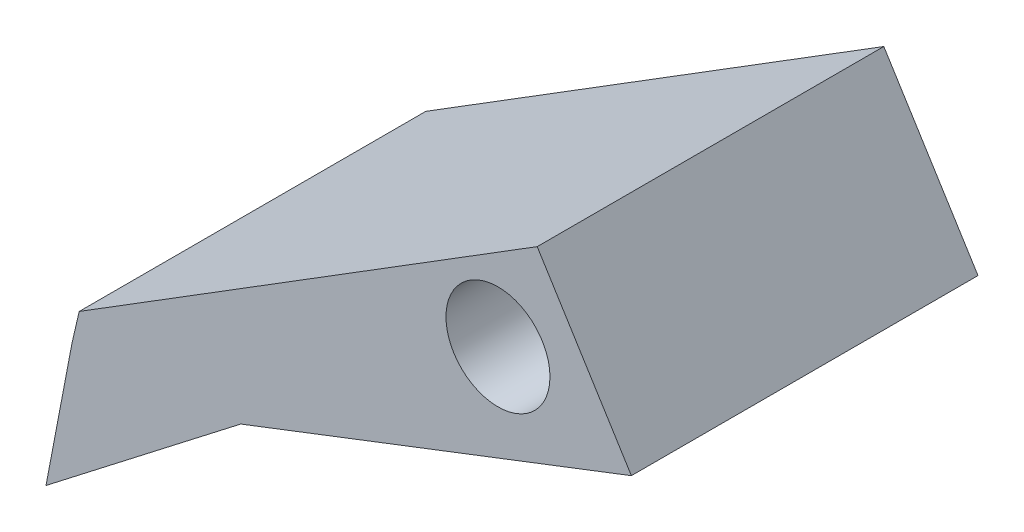
ISO-10303-21;
HEADER;
FILE_DESCRIPTION(('STEP AP214'),'2;1');
FILE_NAME('part.step','',(''),(''),'','','');
FILE_SCHEMA(('AUTOMOTIVE_DESIGN { 1 0 10303 214 1 1 1 1 }'));
ENDSEC;
DATA;
#1=APPLICATION_CONTEXT('core data for automotive mechanical design processes');
#2=APPLICATION_PROTOCOL_DEFINITION('international standard','automotive_design',2000,#1);
#3=PRODUCT_CONTEXT('',#1,'mechanical');
#4=PRODUCT('Part','Part','',(#3));
#5=PRODUCT_RELATED_PRODUCT_CATEGORY('part','',(#4));
#6=PRODUCT_DEFINITION_FORMATION('','',#4);
#7=PRODUCT_DEFINITION_CONTEXT('part definition',#1,'design');
#8=PRODUCT_DEFINITION('design','',#6,#7);
#9=PRODUCT_DEFINITION_SHAPE('','',#8);
#10=(LENGTH_UNIT() NAMED_UNIT(*) SI_UNIT(.MILLI.,.METRE.));
#11=(NAMED_UNIT(*) PLANE_ANGLE_UNIT() SI_UNIT($,.RADIAN.));
#12=(NAMED_UNIT(*) SI_UNIT($,.STERADIAN.) SOLID_ANGLE_UNIT());
#13=UNCERTAINTY_MEASURE_WITH_UNIT(LENGTH_MEASURE(1.E-05),#10,'distance_accuracy_value','');
#14=(GEOMETRIC_REPRESENTATION_CONTEXT(3) GLOBAL_UNCERTAINTY_ASSIGNED_CONTEXT((#13)) GLOBAL_UNIT_ASSIGNED_CONTEXT((#10,
#11,#12)) REPRESENTATION_CONTEXT('',''));
#15=CARTESIAN_POINT('',(0.,0.,0.));
#16=DIRECTION('',(0.,0.,1.));
#17=DIRECTION('',(1.,0.,0.));
#18=AXIS2_PLACEMENT_3D('',#15,#16,#17);
#19=CARTESIAN_POINT('',(0.,0.,10.));
#20=DIRECTION('',(0.,0.,-1.));
#21=DIRECTION('',(-1.,0.,0.));
#22=AXIS2_PLACEMENT_3D('',#19,#20,#21);
#23=PLANE('',#22);
#24=DIRECTION('',(0.79110087859855,0.611685703511698,0.));
#25=VECTOR('',#24,1.);
#26=CARTESIAN_POINT('',(0.,18.0912687522969,10.));
#27=LINE('',#26,#25);
#28=CARTESIAN_POINT('',(0.,18.0912687522969,10.));
#29=VERTEX_POINT('',#28);
#30=CARTESIAN_POINT('',(5.61872422569243,22.4357125189621,10.));
#31=VERTEX_POINT('',#30);
#32=EDGE_CURVE('E131',#29,#31,#27,.T.);
#33=ORIENTED_EDGE('',*,*,#32,.T.);
#34=DIRECTION('',(0.933066568106033,0.359703738488815,0.));
#35=VECTOR('',#34,1.);
#36=CARTESIAN_POINT('',(5.61872422569243,22.4357125189621,10.));
#37=LINE('',#36,#35);
#38=CARTESIAN_POINT('',(16.8881518183056,26.7801562856273,10.));
#39=VERTEX_POINT('',#38);
#40=EDGE_CURVE('E89',#31,#39,#37,.T.);
#41=ORIENTED_EDGE('',*,*,#40,.T.);
#42=DIRECTION('',(-0.528499803503971,0.848933423594727,0.));
#43=VECTOR('',#42,1.);
#44=CARTESIAN_POINT('',(14.1710727650188,31.1446219062223,10.));
#45=LINE('',#44,#43);
#46=CARTESIAN_POINT('',(14.1710727650188,31.1446219062223,10.));
#47=VERTEX_POINT('',#46);
#48=EDGE_CURVE('E102',#39,#47,#45,.T.);
#49=ORIENTED_EDGE('',*,*,#48,.T.);
#50=DIRECTION('',(-0.848933423594727,-0.528499803503972,0.));
#51=VECTOR('',#50,1.);
#52=CARTESIAN_POINT('',(0.958016554359848,22.9188913401539,10.));
#53=LINE('',#52,#51);
#54=CARTESIAN_POINT('',(0.958016554359848,22.9188913401539,10.));
#55=VERTEX_POINT('',#54);
#56=EDGE_CURVE('E96',#47,#55,#53,.T.);
#57=ORIENTED_EDGE('',*,*,#56,.T.);
#58=DIRECTION('',(-0.226580785686339,-0.973992375513156,0.));
#59=VECTOR('',#58,1.);
#60=CARTESIAN_POINT('',(0.752978387852972,22.037503228351,10.));
#61=LINE('',#60,#59);
#62=CARTESIAN_POINT('',(0.752978387852972,22.037503228351,10.));
#63=VERTEX_POINT('',#62);
#64=EDGE_CURVE('E100',#55,#63,#61,.T.);
#65=ORIENTED_EDGE('',*,*,#64,.T.);
#66=DIRECTION('',(-0.187427884692937,-0.982278365861496,0.));
#67=VECTOR('',#66,1.);
#68=CARTESIAN_POINT('',(0.,18.0912687522969,10.));
#69=LINE('',#68,#67);
#70=EDGE_CURVE('E52',#63,#29,#69,.T.);
#71=ORIENTED_EDGE('',*,*,#70,.T.);
#72=EDGE_LOOP('',(#33,#41,#49,#57,#65,#71));
#73=FACE_BOUND('',#72,.T.);
#74=CARTESIAN_POINT('',(13.0393468514576,28.0752855182967,10.));
#75=DIRECTION('',(0.,0.,1.));
#76=DIRECTION('',(1.,0.,0.));
#77=AXIS2_PLACEMENT_3D('',#74,#75,#76);
#78=CIRCLE('',#77,1.5);
#79=CARTESIAN_POINT('',(14.5393468514576,28.0752855182967,10.));
#80=VERTEX_POINT('',#79);
#81=EDGE_CURVE('E124',#80,#80,#78,.T.);
#82=ORIENTED_EDGE('',*,*,#81,.F.);
#83=EDGE_LOOP('',(#82));
#84=FACE_BOUND('',#83,.T.);
#85=ADVANCED_FACE('F35',(#73,#84),#23,.F.);
#86=CARTESIAN_POINT('',(0.,0.,0.));
#87=DIRECTION('',(0.,0.,-1.));
#88=DIRECTION('',(-1.,0.,0.));
#89=AXIS2_PLACEMENT_3D('',#86,#87,#88);
#90=PLANE('',#89);
#91=DIRECTION('',(0.79110087859855,0.611685703511698,0.));
#92=VECTOR('',#91,1.);
#93=CARTESIAN_POINT('',(0.,18.0912687522969,0.));
#94=LINE('',#93,#92);
#95=CARTESIAN_POINT('',(0.,18.0912687522969,0.));
#96=VERTEX_POINT('',#95);
#97=CARTESIAN_POINT('',(5.61872422569243,22.4357125189621,0.));
#98=VERTEX_POINT('',#97);
#99=EDGE_CURVE('E120',#96,#98,#94,.T.);
#100=ORIENTED_EDGE('',*,*,#99,.F.);
#101=DIRECTION('',(-0.187427884692937,-0.982278365861496,0.));
#102=VECTOR('',#101,1.);
#103=CARTESIAN_POINT('',(0.,18.0912687522969,0.));
#104=LINE('',#103,#102);
#105=CARTESIAN_POINT('',(0.752978387852972,22.037503228351,0.));
#106=VERTEX_POINT('',#105);
#107=EDGE_CURVE('E81',#106,#96,#104,.T.);
#108=ORIENTED_EDGE('',*,*,#107,.F.);
#109=DIRECTION('',(-0.226580785686339,-0.973992375513156,0.));
#110=VECTOR('',#109,1.);
#111=CARTESIAN_POINT('',(0.752978387852972,22.037503228351,0.));
#112=LINE('',#111,#110);
#113=CARTESIAN_POINT('',(0.958016554359848,22.9188913401539,0.));
#114=VERTEX_POINT('',#113);
#115=EDGE_CURVE('E75',#114,#106,#112,.T.);
#116=ORIENTED_EDGE('',*,*,#115,.F.);
#117=DIRECTION('',(-0.848933423594727,-0.528499803503972,0.));
#118=VECTOR('',#117,1.);
#119=CARTESIAN_POINT('',(0.958016554359848,22.9188913401539,0.));
#120=LINE('',#119,#118);
#121=CARTESIAN_POINT('',(14.1710727650188,31.1446219062223,0.));
#122=VERTEX_POINT('',#121);
#123=EDGE_CURVE('E110',#122,#114,#120,.T.);
#124=ORIENTED_EDGE('',*,*,#123,.F.);
#125=DIRECTION('',(-0.528499803503971,0.848933423594727,0.));
#126=VECTOR('',#125,1.);
#127=CARTESIAN_POINT('',(14.1710727650188,31.1446219062223,0.));
#128=LINE('',#127,#126);
#129=CARTESIAN_POINT('',(16.8881518183056,26.7801562856273,0.));
#130=VERTEX_POINT('',#129);
#131=EDGE_CURVE('E126',#130,#122,#128,.T.);
#132=ORIENTED_EDGE('',*,*,#131,.F.);
#133=DIRECTION('',(0.933066568106033,0.359703738488815,0.));
#134=VECTOR('',#133,1.);
#135=CARTESIAN_POINT('',(5.61872422569243,22.4357125189621,0.));
#136=LINE('',#135,#134);
#137=EDGE_CURVE('E123',#98,#130,#136,.T.);
#138=ORIENTED_EDGE('',*,*,#137,.F.);
#139=EDGE_LOOP('',(#100,#108,#116,#124,#132,#138));
#140=FACE_BOUND('',#139,.T.);
#141=CARTESIAN_POINT('',(13.0393468514576,28.0752855182967,0.));
#142=DIRECTION('',(0.,0.,1.));
#143=DIRECTION('',(1.,0.,0.));
#144=AXIS2_PLACEMENT_3D('',#141,#142,#143);
#145=CIRCLE('',#144,1.5);
#146=CARTESIAN_POINT('',(14.5393468514576,28.0752855182967,0.));
#147=VERTEX_POINT('',#146);
#148=EDGE_CURVE('E224',#147,#147,#145,.T.);
#149=ORIENTED_EDGE('',*,*,#148,.T.);
#150=EDGE_LOOP('',(#149));
#151=FACE_BOUND('',#150,.T.);
#152=ADVANCED_FACE('F140',(#140,#151),#90,.T.);
#153=CARTESIAN_POINT('',(0.,18.0912687522969,10.));
#154=DIRECTION('',(-0.611685703511698,0.79110087859855,0.));
#155=DIRECTION('',(-0.79110087859855,-0.611685703511698,0.));
#156=AXIS2_PLACEMENT_3D('',#153,#154,#155);
#157=PLANE('',#156);
#158=ORIENTED_EDGE('',*,*,#99,.T.);
#159=DIRECTION('',(0.,0.,-1.));
#160=VECTOR('',#159,1.);
#161=CARTESIAN_POINT('',(5.61872422569243,22.4357125189621,10.));
#162=LINE('',#161,#160);
#163=EDGE_CURVE('E11',#31,#98,#162,.T.);
#164=ORIENTED_EDGE('',*,*,#163,.F.);
#165=ORIENTED_EDGE('',*,*,#32,.F.);
#166=DIRECTION('',(0.,0.,-1.));
#167=VECTOR('',#166,1.);
#168=CARTESIAN_POINT('',(0.,18.0912687522969,10.));
#169=LINE('',#168,#167);
#170=EDGE_CURVE('E116',#29,#96,#169,.T.);
#171=ORIENTED_EDGE('',*,*,#170,.T.);
#172=EDGE_LOOP('',(#158,#164,#165,#171));
#173=FACE_BOUND('',#172,.T.);
#174=ADVANCED_FACE('F37',(#173),#157,.F.);
#175=CARTESIAN_POINT('',(5.61872422569243,22.4357125189621,10.));
#176=DIRECTION('',(-0.359703738488815,0.933066568106033,0.));
#177=DIRECTION('',(-0.933066568106033,-0.359703738488815,0.));
#178=AXIS2_PLACEMENT_3D('',#175,#176,#177);
#179=PLANE('',#178);
#180=ORIENTED_EDGE('',*,*,#137,.T.);
#181=DIRECTION('',(0.,0.,-1.));
#182=VECTOR('',#181,1.);
#183=CARTESIAN_POINT('',(16.8881518183056,26.7801562856273,10.));
#184=LINE('',#183,#182);
#185=EDGE_CURVE('E44',#39,#130,#184,.T.);
#186=ORIENTED_EDGE('',*,*,#185,.F.);
#187=ORIENTED_EDGE('',*,*,#40,.F.);
#188=ORIENTED_EDGE('',*,*,#163,.T.);
#189=EDGE_LOOP('',(#180,#186,#187,#188));
#190=FACE_BOUND('',#189,.T.);
#191=ADVANCED_FACE('F165',(#190),#179,.F.);
#192=CARTESIAN_POINT('',(14.1710727650188,31.1446219062223,10.));
#193=DIRECTION('',(-0.848933423594727,-0.528499803503971,0.));
#194=DIRECTION('',(0.528499803503971,-0.848933423594727,0.));
#195=AXIS2_PLACEMENT_3D('',#192,#193,#194);
#196=PLANE('',#195);
#197=ORIENTED_EDGE('',*,*,#131,.T.);
#198=DIRECTION('',(0.,0.,-1.));
#199=VECTOR('',#198,1.);
#200=CARTESIAN_POINT('',(14.1710727650188,31.1446219062223,10.));
#201=LINE('',#200,#199);
#202=EDGE_CURVE('E111',#47,#122,#201,.T.);
#203=ORIENTED_EDGE('',*,*,#202,.F.);
#204=ORIENTED_EDGE('',*,*,#48,.F.);
#205=ORIENTED_EDGE('',*,*,#185,.T.);
#206=EDGE_LOOP('',(#197,#203,#204,#205));
#207=FACE_BOUND('',#206,.T.);
#208=ADVANCED_FACE('F137',(#207),#196,.F.);
#209=CARTESIAN_POINT('',(0.958016554359848,22.9188913401539,10.));
#210=DIRECTION('',(0.528499803503972,-0.848933423594727,0.));
#211=DIRECTION('',(0.848933423594727,0.528499803503972,0.));
#212=AXIS2_PLACEMENT_3D('',#209,#210,#211);
#213=PLANE('',#212);
#214=ORIENTED_EDGE('',*,*,#123,.T.);
#215=DIRECTION('',(0.,0.,-1.));
#216=VECTOR('',#215,1.);
#217=CARTESIAN_POINT('',(0.958016554359848,22.9188913401539,10.));
#218=LINE('',#217,#216);
#219=EDGE_CURVE('E107',#55,#114,#218,.T.);
#220=ORIENTED_EDGE('',*,*,#219,.F.);
#221=ORIENTED_EDGE('',*,*,#56,.F.);
#222=ORIENTED_EDGE('',*,*,#202,.T.);
#223=EDGE_LOOP('',(#214,#220,#221,#222));
#224=FACE_BOUND('',#223,.T.);
#225=ADVANCED_FACE('F108',(#224),#213,.F.);
#226=CARTESIAN_POINT('',(0.752978387852972,22.037503228351,10.));
#227=DIRECTION('',(0.973992375513156,-0.226580785686339,0.));
#228=DIRECTION('',(0.226580785686339,0.973992375513156,0.));
#229=AXIS2_PLACEMENT_3D('',#226,#227,#228);
#230=PLANE('',#229);
#231=ORIENTED_EDGE('',*,*,#115,.T.);
#232=DIRECTION('',(0.,0.,-1.));
#233=VECTOR('',#232,1.);
#234=CARTESIAN_POINT('',(0.752978387852972,22.037503228351,10.));
#235=LINE('',#234,#233);
#236=EDGE_CURVE('E112',#63,#106,#235,.T.);
#237=ORIENTED_EDGE('',*,*,#236,.F.);
#238=ORIENTED_EDGE('',*,*,#64,.F.);
#239=ORIENTED_EDGE('',*,*,#219,.T.);
#240=EDGE_LOOP('',(#231,#237,#238,#239));
#241=FACE_BOUND('',#240,.T.);
#242=ADVANCED_FACE('F114',(#241),#230,.F.);
#243=CARTESIAN_POINT('',(0.,18.0912687522969,10.));
#244=DIRECTION('',(0.982278365861496,-0.187427884692937,0.));
#245=DIRECTION('',(0.187427884692937,0.982278365861496,0.));
#246=AXIS2_PLACEMENT_3D('',#243,#244,#245);
#247=PLANE('',#246);
#248=ORIENTED_EDGE('',*,*,#107,.T.);
#249=ORIENTED_EDGE('',*,*,#170,.F.);
#250=ORIENTED_EDGE('',*,*,#70,.F.);
#251=ORIENTED_EDGE('',*,*,#236,.T.);
#252=EDGE_LOOP('',(#248,#249,#250,#251));
#253=FACE_BOUND('',#252,.T.);
#254=ADVANCED_FACE('F145',(#253),#247,.F.);
#255=CARTESIAN_POINT('',(13.0393468514576,28.0752855182967,10.));
#256=DIRECTION('',(0.,0.,-1.));
#257=DIRECTION('',(-1.,0.,0.));
#258=AXIS2_PLACEMENT_3D('',#255,#256,#257);
#259=CYLINDRICAL_SURFACE('',#258,1.5);
#260=ORIENTED_EDGE('',*,*,#81,.T.);
#261=EDGE_LOOP('',(#260));
#262=FACE_BOUND('',#261,.T.);
#263=ORIENTED_EDGE('',*,*,#148,.F.);
#264=EDGE_LOOP('',(#263));
#265=FACE_BOUND('',#264,.T.);
#266=ADVANCED_FACE('F147',(#262,#265),#259,.F.);
#267=CLOSED_SHELL('',(#85,#152,#174,#191,#208,#225,#242,#254,#266));
#268=MANIFOLD_SOLID_BREP('B2',#267);
#269=ADVANCED_BREP_SHAPE_REPRESENTATION('',(#18,#268),#14);
#270=SHAPE_DEFINITION_REPRESENTATION(#9,#269);
ENDSEC;
END-ISO-10303-21;
